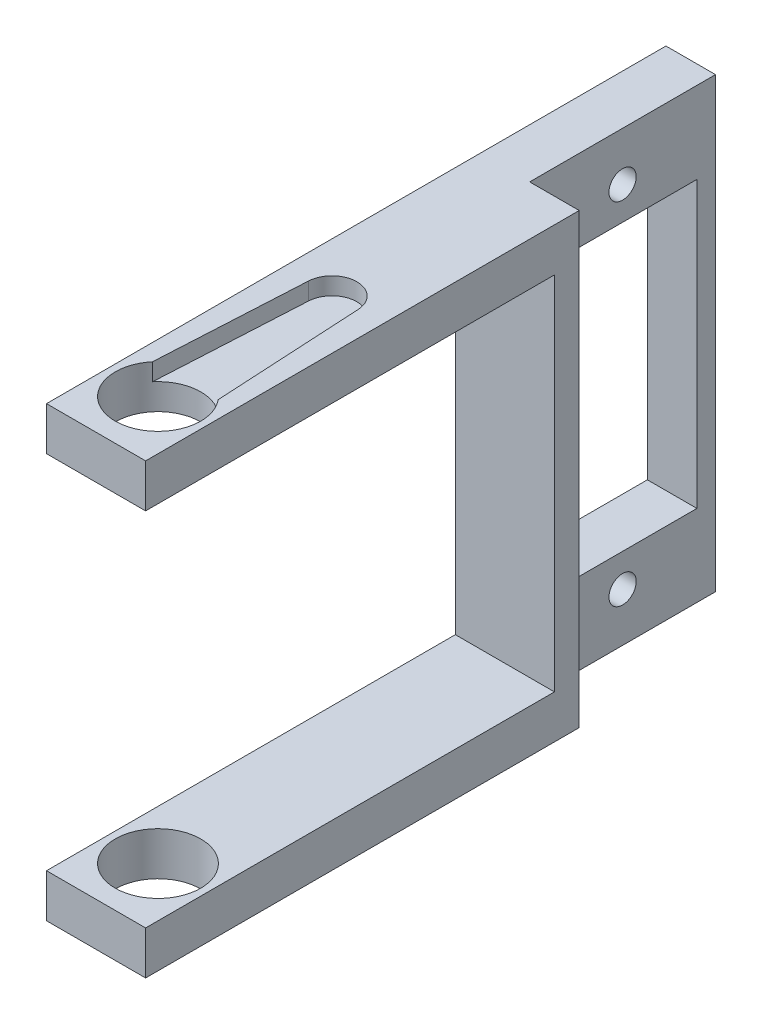
ISO-10303-21;
HEADER;
FILE_DESCRIPTION(('STEP AP214'),'2;1');
FILE_NAME('part.step','',(''),(''),'','','');
FILE_SCHEMA(('AUTOMOTIVE_DESIGN { 1 0 10303 214 1 1 1 1 }'));
ENDSEC;
DATA;
#1=APPLICATION_CONTEXT('core data for automotive mechanical design processes');
#2=APPLICATION_PROTOCOL_DEFINITION('international standard','automotive_design',2000,#1);
#3=PRODUCT_CONTEXT('',#1,'mechanical');
#4=PRODUCT('Part','Part','',(#3));
#5=PRODUCT_RELATED_PRODUCT_CATEGORY('part','',(#4));
#6=PRODUCT_DEFINITION_FORMATION('','',#4);
#7=PRODUCT_DEFINITION_CONTEXT('part definition',#1,'design');
#8=PRODUCT_DEFINITION('design','',#6,#7);
#9=PRODUCT_DEFINITION_SHAPE('','',#8);
#10=(LENGTH_UNIT() NAMED_UNIT(*) SI_UNIT(.MILLI.,.METRE.));
#11=(NAMED_UNIT(*) PLANE_ANGLE_UNIT() SI_UNIT($,.RADIAN.));
#12=(NAMED_UNIT(*) SI_UNIT($,.STERADIAN.) SOLID_ANGLE_UNIT());
#13=UNCERTAINTY_MEASURE_WITH_UNIT(LENGTH_MEASURE(1.E-05),#10,'distance_accuracy_value','');
#14=(GEOMETRIC_REPRESENTATION_CONTEXT(3) GLOBAL_UNCERTAINTY_ASSIGNED_CONTEXT((#13)) GLOBAL_UNIT_ASSIGNED_CONTEXT((#10,
#11,#12)) REPRESENTATION_CONTEXT('',''));
#15=CARTESIAN_POINT('',(0.,0.,0.));
#16=DIRECTION('',(0.,0.,1.));
#17=DIRECTION('',(1.,0.,0.));
#18=AXIS2_PLACEMENT_3D('',#15,#16,#17);
#19=CARTESIAN_POINT('',(0.,0.,0.));
#20=DIRECTION('',(0.,0.,1.));
#21=DIRECTION('',(1.,0.,0.));
#22=AXIS2_PLACEMENT_3D('',#19,#20,#21);
#23=PLANE('',#22);
#24=DIRECTION('',(0.,-1.,0.));
#25=VECTOR('',#24,1.);
#26=CARTESIAN_POINT('',(-4.68154539456755,1.03649304842668,0.));
#27=LINE('',#26,#25);
#28=CARTESIAN_POINT('',(-4.68154539456755,1.03649304842668,0.));
#29=VERTEX_POINT('',#28);
#30=CARTESIAN_POINT('',(-4.68154539456755,-35.1135069515733,0.));
#31=VERTEX_POINT('',#30);
#32=EDGE_CURVE('E293',#29,#31,#27,.T.);
#33=ORIENTED_EDGE('',*,*,#32,.F.);
#34=DIRECTION('',(1.,0.,0.));
#35=VECTOR('',#34,1.);
#36=CARTESIAN_POINT('',(0.,1.03649304842668,0.));
#37=LINE('',#36,#35);
#38=CARTESIAN_POINT('',(-0.681545394567553,1.03649304842668,0.));
#39=VERTEX_POINT('',#38);
#40=EDGE_CURVE('E355',#29,#39,#37,.T.);
#41=ORIENTED_EDGE('',*,*,#40,.T.);
#42=DIRECTION('',(0.,-1.,0.));
#43=VECTOR('',#42,1.);
#44=CARTESIAN_POINT('',(-0.681545394567553,0.,0.));
#45=LINE('',#44,#43);
#46=CARTESIAN_POINT('',(-0.681545394567551,-35.1135069515733,0.));
#47=VERTEX_POINT('',#46);
#48=EDGE_CURVE('E349',#39,#47,#45,.T.);
#49=ORIENTED_EDGE('',*,*,#48,.T.);
#50=DIRECTION('',(1.,0.,0.));
#51=VECTOR('',#50,1.);
#52=CARTESIAN_POINT('',(-8.68154539456755,-35.1135069515733,0.));
#53=LINE('',#52,#51);
#54=EDGE_CURVE('E289',#31,#47,#53,.T.);
#55=ORIENTED_EDGE('',*,*,#54,.F.);
#56=EDGE_LOOP('',(#33,#41,#49,#55));
#57=FACE_BOUND('',#56,.T.);
#58=ADVANCED_FACE('F43',(#57),#23,.F.);
#59=CARTESIAN_POINT('',(-8.68154539456755,0.,35.));
#60=DIRECTION('',(1.,0.,0.));
#61=DIRECTION('',(0.,0.,-1.));
#62=AXIS2_PLACEMENT_3D('',#59,#60,#61);
#63=PLANE('',#62);
#64=CARTESIAN_POINT('',(-8.68154539456755,-31.1885069515733,-7.5));
#65=DIRECTION('',(1.,0.,0.));
#66=DIRECTION('',(0.,0.,-1.));
#67=AXIS2_PLACEMENT_3D('',#64,#65,#66);
#68=CIRCLE('',#67,1.1);
#69=CARTESIAN_POINT('',(-8.68154539456755,-31.1885069515733,-8.6));
#70=VERTEX_POINT('',#69);
#71=EDGE_CURVE('E225',#70,#70,#68,.F.);
#72=ORIENTED_EDGE('',*,*,#71,.F.);
#73=EDGE_LOOP('',(#72));
#74=FACE_BOUND('',#73,.T.);
#75=CARTESIAN_POINT('',(-8.68154539456755,-2.88850695157332,-7.5));
#76=DIRECTION('',(1.,0.,0.));
#77=DIRECTION('',(0.,0.,-1.));
#78=AXIS2_PLACEMENT_3D('',#75,#76,#77);
#79=CIRCLE('',#78,1.1);
#80=CARTESIAN_POINT('',(-8.68154539456755,-2.88850695157332,-8.6));
#81=VERTEX_POINT('',#80);
#82=EDGE_CURVE('E224',#81,#81,#79,.F.);
#83=ORIENTED_EDGE('',*,*,#82,.F.);
#84=EDGE_LOOP('',(#83));
#85=FACE_BOUND('',#84,.T.);
#86=DIRECTION('',(0.,0.,-1.));
#87=VECTOR('',#86,1.);
#88=CARTESIAN_POINT('',(-8.68154539456755,-5.53850695157332,-1.5));
#89=LINE('',#88,#87);
#90=CARTESIAN_POINT('',(-8.68154539456755,-5.53850695157332,-1.5));
#91=VERTEX_POINT('',#90);
#92=CARTESIAN_POINT('',(-8.68154539456755,-5.53850695157332,-13.5));
#93=VERTEX_POINT('',#92);
#94=EDGE_CURVE('E237',#91,#93,#89,.T.);
#95=ORIENTED_EDGE('',*,*,#94,.F.);
#96=DIRECTION('',(0.,1.,0.));
#97=VECTOR('',#96,1.);
#98=CARTESIAN_POINT('',(-8.68154539456755,-5.53850695157332,-1.5));
#99=LINE('',#98,#97);
#100=CARTESIAN_POINT('',(-8.68154539456755,-28.5385069515733,-1.5));
#101=VERTEX_POINT('',#100);
#102=EDGE_CURVE('E241',#101,#91,#99,.T.);
#103=ORIENTED_EDGE('',*,*,#102,.F.);
#104=DIRECTION('',(0.,0.,1.));
#105=VECTOR('',#104,1.);
#106=CARTESIAN_POINT('',(-8.68154539456755,-28.5385069515733,-1.5));
#107=LINE('',#106,#105);
#108=CARTESIAN_POINT('',(-8.68154539456755,-28.5385069515733,-13.5));
#109=VERTEX_POINT('',#108);
#110=EDGE_CURVE('E264',#109,#101,#107,.T.);
#111=ORIENTED_EDGE('',*,*,#110,.F.);
#112=DIRECTION('',(0.,-1.,0.));
#113=VECTOR('',#112,1.);
#114=CARTESIAN_POINT('',(-8.68154539456755,-5.53850695157332,-13.5));
#115=LINE('',#114,#113);
#116=EDGE_CURVE('E67',#93,#109,#115,.T.);
#117=ORIENTED_EDGE('',*,*,#116,.F.);
#118=EDGE_LOOP('',(#95,#103,#111,#117));
#119=FACE_BOUND('',#118,.T.);
#120=DIRECTION('',(0.,0.,-1.));
#121=VECTOR('',#120,1.);
#122=CARTESIAN_POINT('',(-8.68154539456755,1.03649304842668,35.));
#123=LINE('',#122,#121);
#124=CARTESIAN_POINT('',(-8.68154539456755,1.03649304842668,35.));
#125=VERTEX_POINT('',#124);
#126=CARTESIAN_POINT('',(-8.68154539456755,1.03649304842668,-15.));
#127=VERTEX_POINT('',#126);
#128=EDGE_CURVE('E366',#125,#127,#123,.T.);
#129=ORIENTED_EDGE('',*,*,#128,.T.);
#130=DIRECTION('',(0.,1.,0.));
#131=VECTOR('',#130,1.);
#132=CARTESIAN_POINT('',(-8.68154539456755,1.03649304842668,-15.));
#133=LINE('',#132,#131);
#134=CARTESIAN_POINT('',(-8.68154539456755,-35.1135069515733,-15.));
#135=VERTEX_POINT('',#134);
#136=EDGE_CURVE('E307',#135,#127,#133,.T.);
#137=ORIENTED_EDGE('',*,*,#136,.F.);
#138=DIRECTION('',(0.,0.,1.));
#139=VECTOR('',#138,1.);
#140=CARTESIAN_POINT('',(-8.68154539456755,-35.1135069515733,-15.));
#141=LINE('',#140,#139);
#142=CARTESIAN_POINT('',(-8.68154539456755,-35.1135069515733,35.));
#143=VERTEX_POINT('',#142);
#144=EDGE_CURVE('E320',#135,#143,#141,.T.);
#145=ORIENTED_EDGE('',*,*,#144,.T.);
#146=DIRECTION('',(0.,1.,0.));
#147=VECTOR('',#146,1.);
#148=CARTESIAN_POINT('',(-8.68154539456755,-35.1135069515733,35.));
#149=LINE('',#148,#147);
#150=CARTESIAN_POINT('',(-8.68154539456755,-31.6135069515733,35.));
#151=VERTEX_POINT('',#150);
#152=EDGE_CURVE('E281',#143,#151,#149,.T.);
#153=ORIENTED_EDGE('',*,*,#152,.T.);
#154=DIRECTION('',(0.,0.,-1.));
#155=VECTOR('',#154,1.);
#156=CARTESIAN_POINT('',(-8.68154539456755,-31.6135069515733,35.));
#157=LINE('',#156,#155);
#158=CARTESIAN_POINT('',(-8.68154539456755,-31.6135069515733,2.));
#159=VERTEX_POINT('',#158);
#160=EDGE_CURVE('E277',#151,#159,#157,.T.);
#161=ORIENTED_EDGE('',*,*,#160,.T.);
#162=DIRECTION('',(0.,-1.,0.));
#163=VECTOR('',#162,1.);
#164=CARTESIAN_POINT('',(-8.68154539456755,0.,2.));
#165=LINE('',#164,#163);
#166=CARTESIAN_POINT('',(-8.68154539456755,-2.46350695157332,2.));
#167=VERTEX_POINT('',#166);
#168=EDGE_CURVE('E333',#167,#159,#165,.T.);
#169=ORIENTED_EDGE('',*,*,#168,.F.);
#170=DIRECTION('',(0.,0.,-1.));
#171=VECTOR('',#170,1.);
#172=CARTESIAN_POINT('',(-8.68154539456755,-2.46350695157332,35.));
#173=LINE('',#172,#171);
#174=CARTESIAN_POINT('',(-8.68154539456755,-2.46350695157332,35.));
#175=VERTEX_POINT('',#174);
#176=EDGE_CURVE('E52',#175,#167,#173,.T.);
#177=ORIENTED_EDGE('',*,*,#176,.F.);
#178=DIRECTION('',(0.,-1.,0.));
#179=VECTOR('',#178,1.);
#180=CARTESIAN_POINT('',(-8.68154539456755,0.,35.));
#181=LINE('',#180,#179);
#182=EDGE_CURVE('E350',#125,#175,#181,.T.);
#183=ORIENTED_EDGE('',*,*,#182,.F.);
#184=EDGE_LOOP('',(#129,#137,#145,#153,#161,#169,#177,#183));
#185=FACE_BOUND('',#184,.T.);
#186=ADVANCED_FACE('F45',(#74,#85,#119,#185),#63,.F.);
#187=CARTESIAN_POINT('',(0.,-2.46350695157332,35.));
#188=DIRECTION('',(0.,1.,0.));
#189=DIRECTION('',(-1.,0.,0.));
#190=AXIS2_PLACEMENT_3D('',#187,#188,#189);
#191=PLANE('',#190);
#192=CARTESIAN_POINT('',(-4.68154539456755,-2.46350695157332,30.));
#193=DIRECTION('',(0.,1.,0.));
#194=DIRECTION('',(-1.,0.,0.));
#195=AXIS2_PLACEMENT_3D('',#192,#193,#194);
#196=CIRCLE('',#195,3.45);
#197=CARTESIAN_POINT('',(-8.13154539456756,-2.46350695157332,30.));
#198=VERTEX_POINT('',#197);
#199=EDGE_CURVE('E198',#198,#198,#196,.T.);
#200=ORIENTED_EDGE('',*,*,#199,.T.);
#201=EDGE_LOOP('',(#200));
#202=FACE_BOUND('',#201,.T.);
#203=ORIENTED_EDGE('',*,*,#176,.T.);
#204=DIRECTION('',(1.,0.,0.));
#205=VECTOR('',#204,1.);
#206=CARTESIAN_POINT('',(0.,-2.46350695157332,2.));
#207=LINE('',#206,#205);
#208=CARTESIAN_POINT('',(-0.681545394567553,-2.46350695157332,2.));
#209=VERTEX_POINT('',#208);
#210=EDGE_CURVE('E345',#167,#209,#207,.T.);
#211=ORIENTED_EDGE('',*,*,#210,.T.);
#212=DIRECTION('',(0.,0.,-1.));
#213=VECTOR('',#212,1.);
#214=CARTESIAN_POINT('',(-0.681545394567553,-2.46350695157332,35.));
#215=LINE('',#214,#213);
#216=CARTESIAN_POINT('',(-0.681545394567553,-2.46350695157332,35.));
#217=VERTEX_POINT('',#216);
#218=EDGE_CURVE('E377',#217,#209,#215,.T.);
#219=ORIENTED_EDGE('',*,*,#218,.F.);
#220=DIRECTION('',(1.,0.,0.));
#221=VECTOR('',#220,1.);
#222=CARTESIAN_POINT('',(0.,-2.46350695157332,35.));
#223=LINE('',#222,#221);
#224=EDGE_CURVE('E354',#175,#217,#223,.T.);
#225=ORIENTED_EDGE('',*,*,#224,.F.);
#226=EDGE_LOOP('',(#203,#211,#219,#225));
#227=FACE_BOUND('',#226,.T.);
#228=ADVANCED_FACE('F384',(#202,#227),#191,.F.);
#229=CARTESIAN_POINT('',(-0.681545394567553,0.,35.));
#230=DIRECTION('',(1.,0.,0.));
#231=DIRECTION('',(0.,1.,0.));
#232=AXIS2_PLACEMENT_3D('',#229,#230,#231);
#233=PLANE('',#232);
#234=ORIENTED_EDGE('',*,*,#48,.F.);
#235=DIRECTION('',(0.,0.,-1.));
#236=VECTOR('',#235,1.);
#237=CARTESIAN_POINT('',(-0.681545394567553,1.03649304842668,35.));
#238=LINE('',#237,#236);
#239=CARTESIAN_POINT('',(-0.681545394567553,1.03649304842668,35.));
#240=VERTEX_POINT('',#239);
#241=EDGE_CURVE('E373',#240,#39,#238,.T.);
#242=ORIENTED_EDGE('',*,*,#241,.F.);
#243=DIRECTION('',(0.,-1.,0.));
#244=VECTOR('',#243,1.);
#245=CARTESIAN_POINT('',(-0.681545394567553,0.,35.));
#246=LINE('',#245,#244);
#247=EDGE_CURVE('E358',#240,#217,#246,.T.);
#248=ORIENTED_EDGE('',*,*,#247,.T.);
#249=ORIENTED_EDGE('',*,*,#218,.T.);
#250=DIRECTION('',(0.,-1.,0.));
#251=VECTOR('',#250,1.);
#252=CARTESIAN_POINT('',(-0.681545394567553,0.,2.));
#253=LINE('',#252,#251);
#254=CARTESIAN_POINT('',(-0.681545394567548,-31.6135069515733,2.));
#255=VERTEX_POINT('',#254);
#256=EDGE_CURVE('E341',#209,#255,#253,.T.);
#257=ORIENTED_EDGE('',*,*,#256,.T.);
#258=DIRECTION('',(0.,0.,-1.));
#259=VECTOR('',#258,1.);
#260=CARTESIAN_POINT('',(-0.681545394567548,-31.6135069515733,35.));
#261=LINE('',#260,#259);
#262=CARTESIAN_POINT('',(-0.681545394567548,-31.6135069515733,35.));
#263=VERTEX_POINT('',#262);
#264=EDGE_CURVE('E278',#263,#255,#261,.T.);
#265=ORIENTED_EDGE('',*,*,#264,.F.);
#266=DIRECTION('',(0.,1.,0.));
#267=VECTOR('',#266,1.);
#268=CARTESIAN_POINT('',(-0.681545394567551,-35.1135069515733,35.));
#269=LINE('',#268,#267);
#270=CARTESIAN_POINT('',(-0.681545394567551,-35.1135069515733,35.));
#271=VERTEX_POINT('',#270);
#272=EDGE_CURVE('E301',#271,#263,#269,.T.);
#273=ORIENTED_EDGE('',*,*,#272,.F.);
#274=DIRECTION('',(0.,0.,-1.));
#275=VECTOR('',#274,1.);
#276=CARTESIAN_POINT('',(-0.681545394567551,-35.1135069515733,35.));
#277=LINE('',#276,#275);
#278=EDGE_CURVE('E282',#271,#47,#277,.T.);
#279=ORIENTED_EDGE('',*,*,#278,.T.);
#280=EDGE_LOOP('',(#234,#242,#248,#249,#257,#265,#273,#279));
#281=FACE_BOUND('',#280,.T.);
#282=ADVANCED_FACE('F395',(#281),#233,.T.);
#283=CARTESIAN_POINT('',(0.,1.03649304842668,35.));
#284=DIRECTION('',(0.,1.,0.));
#285=DIRECTION('',(0.,0.,1.));
#286=AXIS2_PLACEMENT_3D('',#283,#284,#285);
#287=PLANE('',#286);
#288=CARTESIAN_POINT('',(-4.68154539456755,1.03649304842668,30.));
#289=DIRECTION('',(0.,1.,0.));
#290=DIRECTION('',(0.,0.,1.));
#291=AXIS2_PLACEMENT_3D('',#288,#289,#290);
#292=CIRCLE('',#291,3.45);
#293=CARTESIAN_POINT('',(-7.33154539456758,1.03649304842668,27.7909277965626));
#294=VERTEX_POINT('',#293);
#295=CARTESIAN_POINT('',(-2.03154539456757,1.03649304842668,27.7909277965625));
#296=VERTEX_POINT('',#295);
#297=EDGE_CURVE('E59',#294,#296,#292,.T.);
#298=ORIENTED_EDGE('',*,*,#297,.F.);
#299=DIRECTION('',(-0.0545609835210622,0.,0.998510440144325));
#300=VECTOR('',#299,1.);
#301=CARTESIAN_POINT('',(-7.33154539456758,1.03649304842668,27.7909277965626));
#302=LINE('',#301,#300);
#303=CARTESIAN_POINT('',(-6.67856627485635,1.03649304842668,15.8408780329579));
#304=VERTEX_POINT('',#303);
#305=EDGE_CURVE('E189',#304,#294,#302,.T.);
#306=ORIENTED_EDGE('',*,*,#305,.F.);
#307=CARTESIAN_POINT('',(-4.6815453945677,1.03649304842668,15.95));
#308=DIRECTION('',(0.,1.,0.));
#309=DIRECTION('',(0.,0.,1.));
#310=AXIS2_PLACEMENT_3D('',#307,#308,#309);
#311=CIRCLE('',#310,2.);
#312=CARTESIAN_POINT('',(-2.68452451427906,1.03649304842668,15.8408780329578));
#313=VERTEX_POINT('',#312);
#314=EDGE_CURVE('E195',#313,#304,#311,.T.);
#315=ORIENTED_EDGE('',*,*,#314,.F.);
#316=DIRECTION('',(-0.0545609835210836,0.,-0.998510440144324));
#317=VECTOR('',#316,1.);
#318=CARTESIAN_POINT('',(-2.68452451427906,1.03649304842668,15.8408780329578));
#319=LINE('',#318,#317);
#320=EDGE_CURVE('E205',#296,#313,#319,.T.);
#321=ORIENTED_EDGE('',*,*,#320,.F.);
#322=EDGE_LOOP('',(#298,#306,#315,#321));
#323=FACE_BOUND('',#322,.T.);
#324=ORIENTED_EDGE('',*,*,#40,.F.);
#325=DIRECTION('',(0.,0.,1.));
#326=VECTOR('',#325,1.);
#327=CARTESIAN_POINT('',(-4.68154539456755,1.03649304842668,-15.));
#328=LINE('',#327,#326);
#329=CARTESIAN_POINT('',(-4.68154539456755,1.03649304842668,-15.));
#330=VERTEX_POINT('',#329);
#331=EDGE_CURVE('E329',#330,#29,#328,.T.);
#332=ORIENTED_EDGE('',*,*,#331,.F.);
#333=DIRECTION('',(1.,0.,0.));
#334=VECTOR('',#333,1.);
#335=CARTESIAN_POINT('',(-8.68154539456755,1.03649304842668,-15.));
#336=LINE('',#335,#334);
#337=EDGE_CURVE('E311',#127,#330,#336,.T.);
#338=ORIENTED_EDGE('',*,*,#337,.F.);
#339=ORIENTED_EDGE('',*,*,#128,.F.);
#340=DIRECTION('',(1.,0.,0.));
#341=VECTOR('',#340,1.);
#342=CARTESIAN_POINT('',(0.,1.03649304842668,35.));
#343=LINE('',#342,#341);
#344=EDGE_CURVE('E362',#125,#240,#343,.T.);
#345=ORIENTED_EDGE('',*,*,#344,.T.);
#346=ORIENTED_EDGE('',*,*,#241,.T.);
#347=EDGE_LOOP('',(#324,#332,#338,#339,#345,#346));
#348=FACE_BOUND('',#347,.T.);
#349=ADVANCED_FACE('F402',(#323,#348),#287,.T.);
#350=CARTESIAN_POINT('',(0.,0.,35.));
#351=DIRECTION('',(0.,0.,1.));
#352=DIRECTION('',(1.,0.,0.));
#353=AXIS2_PLACEMENT_3D('',#350,#351,#352);
#354=PLANE('',#353);
#355=ORIENTED_EDGE('',*,*,#182,.T.);
#356=ORIENTED_EDGE('',*,*,#224,.T.);
#357=ORIENTED_EDGE('',*,*,#247,.F.);
#358=ORIENTED_EDGE('',*,*,#344,.F.);
#359=EDGE_LOOP('',(#355,#356,#357,#358));
#360=FACE_BOUND('',#359,.T.);
#361=ADVANCED_FACE('F399',(#360),#354,.T.);
#362=CARTESIAN_POINT('',(0.,0.,2.));
#363=DIRECTION('',(0.,0.,1.));
#364=DIRECTION('',(1.,0.,0.));
#365=AXIS2_PLACEMENT_3D('',#362,#363,#364);
#366=PLANE('',#365);
#367=ORIENTED_EDGE('',*,*,#168,.T.);
#368=DIRECTION('',(1.,0.,0.));
#369=VECTOR('',#368,1.);
#370=CARTESIAN_POINT('',(0.,-31.6135069515733,2.));
#371=LINE('',#370,#369);
#372=EDGE_CURVE('E337',#159,#255,#371,.T.);
#373=ORIENTED_EDGE('',*,*,#372,.T.);
#374=ORIENTED_EDGE('',*,*,#256,.F.);
#375=ORIENTED_EDGE('',*,*,#210,.F.);
#376=EDGE_LOOP('',(#367,#373,#374,#375));
#377=FACE_BOUND('',#376,.T.);
#378=ADVANCED_FACE('F391',(#377),#366,.T.);
#379=CARTESIAN_POINT('',(-4.68154539456755,1.03649304842668,-15.));
#380=DIRECTION('',(-1.,0.,0.));
#381=DIRECTION('',(0.,0.,1.));
#382=AXIS2_PLACEMENT_3D('',#379,#380,#381);
#383=PLANE('',#382);
#384=CARTESIAN_POINT('',(-4.68154539456755,-31.1885069515733,-7.5));
#385=DIRECTION('',(1.,0.,0.));
#386=DIRECTION('',(0.,0.,-1.));
#387=AXIS2_PLACEMENT_3D('',#384,#385,#386);
#388=CIRCLE('',#387,1.1);
#389=CARTESIAN_POINT('',(-4.68154539456755,-31.1885069515733,-8.6));
#390=VERTEX_POINT('',#389);
#391=EDGE_CURVE('E214',#390,#390,#388,.T.);
#392=ORIENTED_EDGE('',*,*,#391,.F.);
#393=EDGE_LOOP('',(#392));
#394=FACE_BOUND('',#393,.T.);
#395=CARTESIAN_POINT('',(-4.68154539456755,-2.88850695157332,-7.5));
#396=DIRECTION('',(1.,0.,0.));
#397=DIRECTION('',(0.,0.,-1.));
#398=AXIS2_PLACEMENT_3D('',#395,#396,#397);
#399=CIRCLE('',#398,1.1);
#400=CARTESIAN_POINT('',(-4.68154539456755,-2.88850695157332,-8.6));
#401=VERTEX_POINT('',#400);
#402=EDGE_CURVE('E220',#401,#401,#399,.T.);
#403=ORIENTED_EDGE('',*,*,#402,.F.);
#404=EDGE_LOOP('',(#403));
#405=FACE_BOUND('',#404,.T.);
#406=DIRECTION('',(0.,0.,-1.));
#407=VECTOR('',#406,1.);
#408=CARTESIAN_POINT('',(-4.68154539456755,-28.5385069515733,-1.5));
#409=LINE('',#408,#407);
#410=CARTESIAN_POINT('',(-4.68154539456755,-28.5385069515733,-1.5));
#411=VERTEX_POINT('',#410);
#412=CARTESIAN_POINT('',(-4.68154539456755,-28.5385069515733,-13.5));
#413=VERTEX_POINT('',#412);
#414=EDGE_CURVE('E248',#411,#413,#409,.T.);
#415=ORIENTED_EDGE('',*,*,#414,.F.);
#416=DIRECTION('',(0.,-1.,0.));
#417=VECTOR('',#416,1.);
#418=CARTESIAN_POINT('',(-4.68154539456755,-5.53850695157332,-1.5));
#419=LINE('',#418,#417);
#420=CARTESIAN_POINT('',(-4.68154539456755,-5.53850695157332,-1.5));
#421=VERTEX_POINT('',#420);
#422=EDGE_CURVE('E245',#421,#411,#419,.T.);
#423=ORIENTED_EDGE('',*,*,#422,.F.);
#424=DIRECTION('',(0.,0.,1.));
#425=VECTOR('',#424,1.);
#426=CARTESIAN_POINT('',(-4.68154539456755,-5.53850695157332,-1.5));
#427=LINE('',#426,#425);
#428=CARTESIAN_POINT('',(-4.68154539456755,-5.53850695157332,-13.5));
#429=VERTEX_POINT('',#428);
#430=EDGE_CURVE('E256',#429,#421,#427,.T.);
#431=ORIENTED_EDGE('',*,*,#430,.F.);
#432=DIRECTION('',(0.,1.,0.));
#433=VECTOR('',#432,1.);
#434=CARTESIAN_POINT('',(-4.68154539456755,-5.53850695157332,-13.5));
#435=LINE('',#434,#433);
#436=EDGE_CURVE('E252',#413,#429,#435,.T.);
#437=ORIENTED_EDGE('',*,*,#436,.F.);
#438=EDGE_LOOP('',(#415,#423,#431,#437));
#439=FACE_BOUND('',#438,.T.);
#440=ORIENTED_EDGE('',*,*,#32,.T.);
#441=DIRECTION('',(0.,0.,1.));
#442=VECTOR('',#441,1.);
#443=CARTESIAN_POINT('',(-4.68154539456755,-35.1135069515733,-15.));
#444=LINE('',#443,#442);
#445=CARTESIAN_POINT('',(-4.68154539456755,-35.1135069515733,-15.));
#446=VERTEX_POINT('',#445);
#447=EDGE_CURVE('E325',#446,#31,#444,.T.);
#448=ORIENTED_EDGE('',*,*,#447,.F.);
#449=DIRECTION('',(0.,-1.,0.));
#450=VECTOR('',#449,1.);
#451=CARTESIAN_POINT('',(-4.68154539456755,1.03649304842668,-15.));
#452=LINE('',#451,#450);
#453=EDGE_CURVE('E314',#330,#446,#452,.T.);
#454=ORIENTED_EDGE('',*,*,#453,.F.);
#455=ORIENTED_EDGE('',*,*,#331,.T.);
#456=EDGE_LOOP('',(#440,#448,#454,#455));
#457=FACE_BOUND('',#456,.T.);
#458=ADVANCED_FACE('F517',(#394,#405,#439,#457),#383,.F.);
#459=CARTESIAN_POINT('',(-8.68154539456755,-35.1135069515733,-15.));
#460=DIRECTION('',(0.,1.,0.));
#461=DIRECTION('',(0.,0.,1.));
#462=AXIS2_PLACEMENT_3D('',#459,#460,#461);
#463=PLANE('',#462);
#464=CARTESIAN_POINT('',(-4.68154539456755,-35.1135069515733,30.));
#465=DIRECTION('',(0.,1.,0.));
#466=DIRECTION('',(0.,0.,1.));
#467=AXIS2_PLACEMENT_3D('',#464,#465,#466);
#468=CIRCLE('',#467,3.45);
#469=CARTESIAN_POINT('',(-4.68154539456755,-35.1135069515733,33.45));
#470=VERTEX_POINT('',#469);
#471=EDGE_CURVE('E458',#470,#470,#468,.T.);
#472=ORIENTED_EDGE('',*,*,#471,.T.);
#473=EDGE_LOOP('',(#472));
#474=FACE_BOUND('',#473,.T.);
#475=ORIENTED_EDGE('',*,*,#447,.T.);
#476=ORIENTED_EDGE('',*,*,#54,.T.);
#477=ORIENTED_EDGE('',*,*,#278,.F.);
#478=DIRECTION('',(1.,0.,0.));
#479=VECTOR('',#478,1.);
#480=CARTESIAN_POINT('',(-8.68154539456755,-35.1135069515733,35.));
#481=LINE('',#480,#479);
#482=EDGE_CURVE('E298',#143,#271,#481,.T.);
#483=ORIENTED_EDGE('',*,*,#482,.F.);
#484=ORIENTED_EDGE('',*,*,#144,.F.);
#485=DIRECTION('',(-1.,0.,0.));
#486=VECTOR('',#485,1.);
#487=CARTESIAN_POINT('',(-8.68154539456755,-35.1135069515733,-15.));
#488=LINE('',#487,#486);
#489=EDGE_CURVE('E317',#446,#135,#488,.T.);
#490=ORIENTED_EDGE('',*,*,#489,.F.);
#491=EDGE_LOOP('',(#475,#476,#477,#483,#484,#490));
#492=FACE_BOUND('',#491,.T.);
#493=ADVANCED_FACE('F414',(#474,#492),#463,.F.);
#494=CARTESIAN_POINT('',(0.,0.,-15.));
#495=DIRECTION('',(0.,0.,1.));
#496=DIRECTION('',(1.,0.,0.));
#497=AXIS2_PLACEMENT_3D('',#494,#495,#496);
#498=PLANE('',#497);
#499=ORIENTED_EDGE('',*,*,#136,.T.);
#500=ORIENTED_EDGE('',*,*,#337,.T.);
#501=ORIENTED_EDGE('',*,*,#453,.T.);
#502=ORIENTED_EDGE('',*,*,#489,.T.);
#503=EDGE_LOOP('',(#499,#500,#501,#502));
#504=FACE_BOUND('',#503,.T.);
#505=ADVANCED_FACE('F409',(#504),#498,.F.);
#506=CARTESIAN_POINT('',(-8.68154539456755,-31.6135069515733,35.));
#507=DIRECTION('',(0.,1.,0.));
#508=DIRECTION('',(0.,0.,1.));
#509=AXIS2_PLACEMENT_3D('',#506,#507,#508);
#510=PLANE('',#509);
#511=CARTESIAN_POINT('',(-4.68154539456755,-31.6135069515733,30.));
#512=DIRECTION('',(0.,1.,0.));
#513=DIRECTION('',(0.,0.,1.));
#514=AXIS2_PLACEMENT_3D('',#511,#512,#513);
#515=CIRCLE('',#514,3.45);
#516=CARTESIAN_POINT('',(-4.68154539456755,-31.6135069515733,33.45));
#517=VERTEX_POINT('',#516);
#518=EDGE_CURVE('E455',#517,#517,#515,.T.);
#519=ORIENTED_EDGE('',*,*,#518,.F.);
#520=EDGE_LOOP('',(#519));
#521=FACE_BOUND('',#520,.T.);
#522=ORIENTED_EDGE('',*,*,#264,.T.);
#523=ORIENTED_EDGE('',*,*,#372,.F.);
#524=ORIENTED_EDGE('',*,*,#160,.F.);
#525=DIRECTION('',(1.,0.,0.));
#526=VECTOR('',#525,1.);
#527=CARTESIAN_POINT('',(-8.68154539456755,-31.6135069515733,35.));
#528=LINE('',#527,#526);
#529=EDGE_CURVE('E294',#151,#263,#528,.T.);
#530=ORIENTED_EDGE('',*,*,#529,.T.);
#531=EDGE_LOOP('',(#522,#523,#524,#530));
#532=FACE_BOUND('',#531,.T.);
#533=ADVANCED_FACE('F421',(#521,#532),#510,.T.);
#534=CARTESIAN_POINT('',(0.,0.,35.));
#535=DIRECTION('',(0.,0.,1.));
#536=DIRECTION('',(1.,0.,0.));
#537=AXIS2_PLACEMENT_3D('',#534,#535,#536);
#538=PLANE('',#537);
#539=ORIENTED_EDGE('',*,*,#529,.F.);
#540=ORIENTED_EDGE('',*,*,#152,.F.);
#541=ORIENTED_EDGE('',*,*,#482,.T.);
#542=ORIENTED_EDGE('',*,*,#272,.T.);
#543=EDGE_LOOP('',(#539,#540,#541,#542));
#544=FACE_BOUND('',#543,.T.);
#545=ADVANCED_FACE('F419',(#544),#538,.T.);
#546=CARTESIAN_POINT('',(-8.68254539456755,-5.53850695157332,-1.5));
#547=DIRECTION('',(0.,0.,1.));
#548=DIRECTION('',(1.,0.,0.));
#549=AXIS2_PLACEMENT_3D('',#546,#547,#548);
#550=PLANE('',#549);
#551=ORIENTED_EDGE('',*,*,#102,.T.);
#552=DIRECTION('',(1.,0.,0.));
#553=VECTOR('',#552,1.);
#554=CARTESIAN_POINT('',(-8.68254539456755,-5.53850695157332,-1.5));
#555=LINE('',#554,#553);
#556=EDGE_CURVE('E261',#91,#421,#555,.T.);
#557=ORIENTED_EDGE('',*,*,#556,.T.);
#558=ORIENTED_EDGE('',*,*,#422,.T.);
#559=DIRECTION('',(1.,0.,0.));
#560=VECTOR('',#559,1.);
#561=CARTESIAN_POINT('',(-8.68254539456755,-28.5385069515733,-1.5));
#562=LINE('',#561,#560);
#563=EDGE_CURVE('E260',#101,#411,#562,.T.);
#564=ORIENTED_EDGE('',*,*,#563,.F.);
#565=EDGE_LOOP('',(#551,#557,#558,#564));
#566=FACE_BOUND('',#565,.T.);
#567=ADVANCED_FACE('F429',(#566),#550,.F.);
#568=CARTESIAN_POINT('',(-8.68254539456755,-5.53850695157332,-1.5));
#569=DIRECTION('',(0.,1.,0.));
#570=DIRECTION('',(0.,0.,1.));
#571=AXIS2_PLACEMENT_3D('',#568,#569,#570);
#572=PLANE('',#571);
#573=ORIENTED_EDGE('',*,*,#94,.T.);
#574=DIRECTION('',(1.,0.,0.));
#575=VECTOR('',#574,1.);
#576=CARTESIAN_POINT('',(-8.68254539456755,-5.53850695157332,-13.5));
#577=LINE('',#576,#575);
#578=EDGE_CURVE('E265',#93,#429,#577,.T.);
#579=ORIENTED_EDGE('',*,*,#578,.T.);
#580=ORIENTED_EDGE('',*,*,#430,.T.);
#581=ORIENTED_EDGE('',*,*,#556,.F.);
#582=EDGE_LOOP('',(#573,#579,#580,#581));
#583=FACE_BOUND('',#582,.T.);
#584=ADVANCED_FACE('F495',(#583),#572,.F.);
#585=CARTESIAN_POINT('',(-8.68254539456755,-5.53850695157332,-13.5));
#586=DIRECTION('',(0.,0.,-1.));
#587=DIRECTION('',(-1.,0.,0.));
#588=AXIS2_PLACEMENT_3D('',#585,#586,#587);
#589=PLANE('',#588);
#590=ORIENTED_EDGE('',*,*,#116,.T.);
#591=DIRECTION('',(1.,0.,0.));
#592=VECTOR('',#591,1.);
#593=CARTESIAN_POINT('',(-8.68254539456755,-28.5385069515733,-13.5));
#594=LINE('',#593,#592);
#595=EDGE_CURVE('E268',#109,#413,#594,.T.);
#596=ORIENTED_EDGE('',*,*,#595,.T.);
#597=ORIENTED_EDGE('',*,*,#436,.T.);
#598=ORIENTED_EDGE('',*,*,#578,.F.);
#599=EDGE_LOOP('',(#590,#596,#597,#598));
#600=FACE_BOUND('',#599,.T.);
#601=ADVANCED_FACE('F498',(#600),#589,.F.);
#602=CARTESIAN_POINT('',(-8.68254539456755,-28.5385069515733,-1.5));
#603=DIRECTION('',(0.,-1.,0.));
#604=DIRECTION('',(0.,0.,-1.));
#605=AXIS2_PLACEMENT_3D('',#602,#603,#604);
#606=PLANE('',#605);
#607=ORIENTED_EDGE('',*,*,#110,.T.);
#608=ORIENTED_EDGE('',*,*,#563,.T.);
#609=ORIENTED_EDGE('',*,*,#414,.T.);
#610=ORIENTED_EDGE('',*,*,#595,.F.);
#611=EDGE_LOOP('',(#607,#608,#609,#610));
#612=FACE_BOUND('',#611,.T.);
#613=ADVANCED_FACE('F490',(#612),#606,.F.);
#614=CARTESIAN_POINT('',(-8.68254539456755,-2.88850695157332,-7.5));
#615=DIRECTION('',(1.,0.,0.));
#616=DIRECTION('',(0.,0.,-1.));
#617=AXIS2_PLACEMENT_3D('',#614,#615,#616);
#618=CYLINDRICAL_SURFACE('',#617,1.1);
#619=ORIENTED_EDGE('',*,*,#402,.T.);
#620=EDGE_LOOP('',(#619));
#621=FACE_BOUND('',#620,.T.);
#622=ORIENTED_EDGE('',*,*,#82,.T.);
#623=EDGE_LOOP('',(#622));
#624=FACE_BOUND('',#623,.T.);
#625=ADVANCED_FACE('F487',(#621,#624),#618,.F.);
#626=CARTESIAN_POINT('',(-8.68254539456755,-31.1885069515733,-7.5));
#627=DIRECTION('',(1.,0.,0.));
#628=DIRECTION('',(0.,0.,-1.));
#629=AXIS2_PLACEMENT_3D('',#626,#627,#628);
#630=CYLINDRICAL_SURFACE('',#629,1.1);
#631=ORIENTED_EDGE('',*,*,#391,.T.);
#632=EDGE_LOOP('',(#631));
#633=FACE_BOUND('',#632,.T.);
#634=ORIENTED_EDGE('',*,*,#71,.T.);
#635=EDGE_LOOP('',(#634));
#636=FACE_BOUND('',#635,.T.);
#637=ADVANCED_FACE('F486',(#633,#636),#630,.F.);
#638=CARTESIAN_POINT('',(-4.68154539456755,-0.363506951573321,30.));
#639=DIRECTION('',(0.,1.,0.));
#640=DIRECTION('',(0.,0.,1.));
#641=AXIS2_PLACEMENT_3D('',#638,#639,#640);
#642=CYLINDRICAL_SURFACE('',#641,3.45);
#643=ORIENTED_EDGE('',*,*,#297,.T.);
#644=DIRECTION('',(0.,1.,0.));
#645=VECTOR('',#644,1.);
#646=CARTESIAN_POINT('',(-2.03154539456757,-0.363506951573321,27.7909277965625));
#647=LINE('',#646,#645);
#648=CARTESIAN_POINT('',(-2.03154539456757,-0.36350695157332,27.7909277965625));
#649=VERTEX_POINT('',#648);
#650=EDGE_CURVE('E176',#649,#296,#647,.T.);
#651=ORIENTED_EDGE('',*,*,#650,.F.);
#652=CARTESIAN_POINT('',(-4.68154539456755,-0.36350695157332,30.));
#653=DIRECTION('',(0.,1.,0.));
#654=DIRECTION('',(0.,0.,1.));
#655=AXIS2_PLACEMENT_3D('',#652,#653,#654);
#656=CIRCLE('',#655,3.45);
#657=CARTESIAN_POINT('',(-7.33154539456758,-0.363506951573321,27.7909277965626));
#658=VERTEX_POINT('',#657);
#659=EDGE_CURVE('E11',#649,#658,#656,.T.);
#660=ORIENTED_EDGE('',*,*,#659,.T.);
#661=DIRECTION('',(0.,1.,0.));
#662=VECTOR('',#661,1.);
#663=CARTESIAN_POINT('',(-7.33154539456758,-0.363506951573321,27.7909277965626));
#664=LINE('',#663,#662);
#665=EDGE_CURVE('E211',#658,#294,#664,.T.);
#666=ORIENTED_EDGE('',*,*,#665,.T.);
#667=EDGE_LOOP('',(#643,#651,#660,#666));
#668=FACE_BOUND('',#667,.T.);
#669=ORIENTED_EDGE('',*,*,#199,.F.);
#670=EDGE_LOOP('',(#669));
#671=FACE_BOUND('',#670,.T.);
#672=ADVANCED_FACE('F177',(#668,#671),#642,.F.);
#673=CARTESIAN_POINT('',(-7.33154539456758,-0.363506951573321,27.7909277965626));
#674=DIRECTION('',(-0.998510440144325,0.,-0.0545609835210622));
#675=DIRECTION('',(-0.0545609835210623,0.,0.998510440144326));
#676=AXIS2_PLACEMENT_3D('',#673,#674,#675);
#677=PLANE('',#676);
#678=ORIENTED_EDGE('',*,*,#305,.T.);
#679=ORIENTED_EDGE('',*,*,#665,.F.);
#680=DIRECTION('',(-0.0545609835210622,0.,0.998510440144325));
#681=VECTOR('',#680,1.);
#682=CARTESIAN_POINT('',(-7.33154539456758,-0.363506951573321,27.7909277965626));
#683=LINE('',#682,#681);
#684=CARTESIAN_POINT('',(-6.67856627485635,-0.363506951573321,15.8408780329579));
#685=VERTEX_POINT('',#684);
#686=EDGE_CURVE('E174',#685,#658,#683,.T.);
#687=ORIENTED_EDGE('',*,*,#686,.F.);
#688=DIRECTION('',(0.,1.,0.));
#689=VECTOR('',#688,1.);
#690=CARTESIAN_POINT('',(-6.67856627485635,-0.363506951573321,15.8408780329579));
#691=LINE('',#690,#689);
#692=EDGE_CURVE('E215',#685,#304,#691,.T.);
#693=ORIENTED_EDGE('',*,*,#692,.T.);
#694=EDGE_LOOP('',(#678,#679,#687,#693));
#695=FACE_BOUND('',#694,.T.);
#696=ADVANCED_FACE('F474',(#695),#677,.F.);
#697=CARTESIAN_POINT('',(-4.6815453945677,-0.363506951573321,15.95));
#698=DIRECTION('',(0.,1.,0.));
#699=DIRECTION('',(0.,0.,1.));
#700=AXIS2_PLACEMENT_3D('',#697,#698,#699);
#701=CYLINDRICAL_SURFACE('',#700,2.);
#702=ORIENTED_EDGE('',*,*,#314,.T.);
#703=ORIENTED_EDGE('',*,*,#692,.F.);
#704=CARTESIAN_POINT('',(-4.6815453945677,-0.363506951573321,15.95));
#705=DIRECTION('',(0.,1.,0.));
#706=DIRECTION('',(0.,0.,1.));
#707=AXIS2_PLACEMENT_3D('',#704,#705,#706);
#708=CIRCLE('',#707,2.);
#709=CARTESIAN_POINT('',(-2.68452451427906,-0.363506951573321,15.8408780329578));
#710=VERTEX_POINT('',#709);
#711=EDGE_CURVE('E188',#710,#685,#708,.T.);
#712=ORIENTED_EDGE('',*,*,#711,.F.);
#713=DIRECTION('',(0.,1.,0.));
#714=VECTOR('',#713,1.);
#715=CARTESIAN_POINT('',(-2.68452451427906,-0.363506951573321,15.8408780329578));
#716=LINE('',#715,#714);
#717=EDGE_CURVE('E183',#710,#313,#716,.T.);
#718=ORIENTED_EDGE('',*,*,#717,.T.);
#719=EDGE_LOOP('',(#702,#703,#712,#718));
#720=FACE_BOUND('',#719,.T.);
#721=ADVANCED_FACE('F477',(#720),#701,.F.);
#722=CARTESIAN_POINT('',(-2.68452451427906,-0.363506951573321,15.8408780329578));
#723=DIRECTION('',(0.998510440144324,0.,-0.0545609835210836));
#724=DIRECTION('',(-0.0545609835210836,0.,-0.998510440144324));
#725=AXIS2_PLACEMENT_3D('',#722,#723,#724);
#726=PLANE('',#725);
#727=ORIENTED_EDGE('',*,*,#320,.T.);
#728=ORIENTED_EDGE('',*,*,#717,.F.);
#729=DIRECTION('',(-0.0545609835210836,0.,-0.998510440144324));
#730=VECTOR('',#729,1.);
#731=CARTESIAN_POINT('',(-2.68452451427906,-0.363506951573321,15.8408780329578));
#732=LINE('',#731,#730);
#733=EDGE_CURVE('E172',#649,#710,#732,.T.);
#734=ORIENTED_EDGE('',*,*,#733,.F.);
#735=ORIENTED_EDGE('',*,*,#650,.T.);
#736=EDGE_LOOP('',(#727,#728,#734,#735));
#737=FACE_BOUND('',#736,.T.);
#738=ADVANCED_FACE('F185',(#737),#726,.F.);
#739=CARTESIAN_POINT('',(-4.68154539456755,-0.363506951573321,30.));
#740=DIRECTION('',(0.,1.,0.));
#741=DIRECTION('',(0.,0.,1.));
#742=AXIS2_PLACEMENT_3D('',#739,#740,#741);
#743=PLANE('',#742);
#744=ORIENTED_EDGE('',*,*,#659,.F.);
#745=ORIENTED_EDGE('',*,*,#733,.T.);
#746=ORIENTED_EDGE('',*,*,#711,.T.);
#747=ORIENTED_EDGE('',*,*,#686,.T.);
#748=EDGE_LOOP('',(#744,#745,#746,#747));
#749=FACE_BOUND('',#748,.T.);
#750=ADVANCED_FACE('F169',(#749),#743,.T.);
#751=CARTESIAN_POINT('',(-4.68154539456755,-35.1135069515733,30.));
#752=DIRECTION('',(0.,1.,0.));
#753=DIRECTION('',(0.,0.,1.));
#754=AXIS2_PLACEMENT_3D('',#751,#752,#753);
#755=CYLINDRICAL_SURFACE('',#754,3.45);
#756=ORIENTED_EDGE('',*,*,#518,.T.);
#757=EDGE_LOOP('',(#756));
#758=FACE_BOUND('',#757,.T.);
#759=ORIENTED_EDGE('',*,*,#471,.F.);
#760=EDGE_LOOP('',(#759));
#761=FACE_BOUND('',#760,.T.);
#762=ADVANCED_FACE('F466',(#758,#761),#755,.F.);
#763=CLOSED_SHELL('',(#58,#186,#228,#282,#349,#361,#378,#458,#493,#505,#533,#545,#567,#584,#601,
#613,#625,#637,#672,#696,#721,#738,#750,#762));
#764=MANIFOLD_SOLID_BREP('B2',#763);
#765=ADVANCED_BREP_SHAPE_REPRESENTATION('',(#18,#764),#14);
#766=SHAPE_DEFINITION_REPRESENTATION(#9,#765);
ENDSEC;
END-ISO-10303-21;
